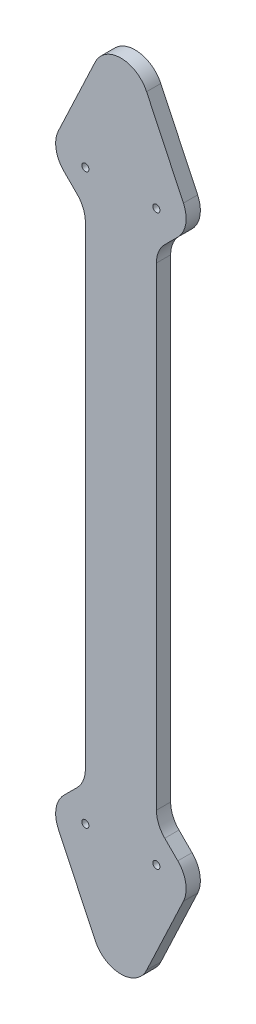
ISO-10303-21;
HEADER;
FILE_DESCRIPTION(('STEP AP214'),'2;1');
FILE_NAME('part.step','',(''),(''),'','','');
FILE_SCHEMA(('AUTOMOTIVE_DESIGN { 1 0 10303 214 1 1 1 1 }'));
ENDSEC;
DATA;
#1=APPLICATION_CONTEXT('core data for automotive mechanical design processes');
#2=APPLICATION_PROTOCOL_DEFINITION('international standard','automotive_design',2000,#1);
#3=PRODUCT_CONTEXT('',#1,'mechanical');
#4=PRODUCT('Part','Part','',(#3));
#5=PRODUCT_RELATED_PRODUCT_CATEGORY('part','',(#4));
#6=PRODUCT_DEFINITION_FORMATION('','',#4);
#7=PRODUCT_DEFINITION_CONTEXT('part definition',#1,'design');
#8=PRODUCT_DEFINITION('design','',#6,#7);
#9=PRODUCT_DEFINITION_SHAPE('','',#8);
#10=(LENGTH_UNIT() NAMED_UNIT(*) SI_UNIT(.MILLI.,.METRE.));
#11=(NAMED_UNIT(*) PLANE_ANGLE_UNIT() SI_UNIT($,.RADIAN.));
#12=(NAMED_UNIT(*) SI_UNIT($,.STERADIAN.) SOLID_ANGLE_UNIT());
#13=UNCERTAINTY_MEASURE_WITH_UNIT(LENGTH_MEASURE(1.E-05),#10,'distance_accuracy_value','');
#14=(GEOMETRIC_REPRESENTATION_CONTEXT(3) GLOBAL_UNCERTAINTY_ASSIGNED_CONTEXT((#13)) GLOBAL_UNIT_ASSIGNED_CONTEXT((#10,
#11,#12)) REPRESENTATION_CONTEXT('',''));
#15=CARTESIAN_POINT('',(0.,0.,0.));
#16=DIRECTION('',(0.,0.,1.));
#17=DIRECTION('',(1.,0.,0.));
#18=AXIS2_PLACEMENT_3D('',#15,#16,#17);
#19=CARTESIAN_POINT('',(9.00000000000001,33.3431457505076,2.));
#20=DIRECTION('',(0.,0.,-1.));
#21=DIRECTION('',(-1.,0.,0.));
#22=AXIS2_PLACEMENT_3D('',#19,#20,#21);
#23=PLANE('',#22);
#24=CARTESIAN_POINT('',(9.00000000000001,33.3431457505076,2.));
#25=DIRECTION('',(0.,0.,-1.));
#26=DIRECTION('',(-1.,0.,0.));
#27=AXIS2_PLACEMENT_3D('',#24,#25,#26);
#28=CIRCLE('',#27,4.00000000000001);
#29=CARTESIAN_POINT('',(4.99999999999999,33.3431457505076,2.));
#30=VERTEX_POINT('',#29);
#31=CARTESIAN_POINT('',(6.17157287525381,36.1715728752538,2.));
#32=VERTEX_POINT('',#31);
#33=EDGE_CURVE('E278',#30,#32,#28,.T.);
#34=ORIENTED_EDGE('',*,*,#33,.T.);
#35=DIRECTION('',(0.707106781186552,0.707106781186542,0.));
#36=VECTOR('',#35,1.);
#37=CARTESIAN_POINT('',(8.01025068313439,38.0102506831344,2.));
#38=LINE('',#37,#36);
#39=CARTESIAN_POINT('',(8.01025068313439,38.0102506831344,2.));
#40=VERTEX_POINT('',#39);
#41=EDGE_CURVE('E142',#32,#40,#38,.T.);
#42=ORIENTED_EDGE('',*,*,#41,.T.);
#43=CARTESIAN_POINT('',(5.1818235583882,40.8386778078806,2.));
#44=DIRECTION('',(0.,0.,1.));
#45=DIRECTION('',(1.,0.,0.));
#46=AXIS2_PLACEMENT_3D('',#43,#44,#45);
#47=CIRCLE('',#46,4.);
#48=CARTESIAN_POINT('',(8.79960124471442,42.5450437159789,2.));
#49=VERTEX_POINT('',#48);
#50=EDGE_CURVE('E347',#40,#49,#47,.T.);
#51=ORIENTED_EDGE('',*,*,#50,.T.);
#52=DIRECTION('',(-0.426591477024574,0.904444421581554,0.));
#53=VECTOR('',#52,1.);
#54=CARTESIAN_POINT('',(3.61777768632622,53.5313659080983,2.));
#55=LINE('',#54,#53);
#56=CARTESIAN_POINT('',(3.61777768632622,53.5313659080983,2.));
#57=VERTEX_POINT('',#56);
#58=EDGE_CURVE('E367',#49,#57,#55,.T.);
#59=ORIENTED_EDGE('',*,*,#58,.T.);
#60=CARTESIAN_POINT('',(0.,51.825,2.));
#61=DIRECTION('',(0.,0.,1.));
#62=DIRECTION('',(-1.,0.,0.));
#63=AXIS2_PLACEMENT_3D('',#60,#61,#62);
#64=CIRCLE('',#63,4.00000000000001);
#65=CARTESIAN_POINT('',(-3.61777768632622,53.5313659080983,2.));
#66=VERTEX_POINT('',#65);
#67=EDGE_CURVE('E363',#57,#66,#64,.T.);
#68=ORIENTED_EDGE('',*,*,#67,.T.);
#69=DIRECTION('',(-0.426591477024574,-0.904444421581554,0.));
#70=VECTOR('',#69,1.);
#71=CARTESIAN_POINT('',(-3.61777768632622,53.5313659080983,2.));
#72=LINE('',#71,#70);
#73=CARTESIAN_POINT('',(-8.79960124471442,42.5450437159789,2.));
#74=VERTEX_POINT('',#73);
#75=EDGE_CURVE('E366',#66,#74,#72,.T.);
#76=ORIENTED_EDGE('',*,*,#75,.T.);
#77=CARTESIAN_POINT('',(-5.1818235583882,40.8386778078806,2.));
#78=DIRECTION('',(0.,0.,1.));
#79=DIRECTION('',(1.,0.,0.));
#80=AXIS2_PLACEMENT_3D('',#77,#78,#79);
#81=CIRCLE('',#80,4.);
#82=CARTESIAN_POINT('',(-8.01025068313439,38.0102506831344,2.));
#83=VERTEX_POINT('',#82);
#84=EDGE_CURVE('E371',#74,#83,#81,.T.);
#85=ORIENTED_EDGE('',*,*,#84,.T.);
#86=DIRECTION('',(0.707106781186552,-0.707106781186542,0.));
#87=VECTOR('',#86,1.);
#88=CARTESIAN_POINT('',(-8.01025068313439,38.0102506831344,2.));
#89=LINE('',#88,#87);
#90=CARTESIAN_POINT('',(-6.17157287525381,36.1715728752538,2.));
#91=VERTEX_POINT('',#90);
#92=EDGE_CURVE('E378',#83,#91,#89,.T.);
#93=ORIENTED_EDGE('',*,*,#92,.T.);
#94=CARTESIAN_POINT('',(-9.00000000000001,33.3431457505076,2.));
#95=DIRECTION('',(0.,0.,-1.));
#96=DIRECTION('',(-1.,0.,0.));
#97=AXIS2_PLACEMENT_3D('',#94,#95,#96);
#98=CIRCLE('',#97,4.00000000000001);
#99=CARTESIAN_POINT('',(-4.99999999999999,33.3431457505076,2.));
#100=VERTEX_POINT('',#99);
#101=EDGE_CURVE('E381',#91,#100,#98,.T.);
#102=ORIENTED_EDGE('',*,*,#101,.T.);
#103=DIRECTION('',(0.,-1.,0.));
#104=VECTOR('',#103,1.);
#105=CARTESIAN_POINT('',(-4.99999999999999,33.3431457505076,2.));
#106=LINE('',#105,#104);
#107=CARTESIAN_POINT('',(-5.,-33.3431457505076,2.));
#108=VERTEX_POINT('',#107);
#109=EDGE_CURVE('E384',#100,#108,#106,.T.);
#110=ORIENTED_EDGE('',*,*,#109,.T.);
#111=CARTESIAN_POINT('',(-9.00000000000001,-33.3431457505076,2.));
#112=DIRECTION('',(0.,0.,-1.));
#113=DIRECTION('',(1.,0.,0.));
#114=AXIS2_PLACEMENT_3D('',#111,#112,#113);
#115=CIRCLE('',#114,4.00000000000001);
#116=CARTESIAN_POINT('',(-6.17157287525381,-36.1715728752538,2.));
#117=VERTEX_POINT('',#116);
#118=EDGE_CURVE('E387',#108,#117,#115,.T.);
#119=ORIENTED_EDGE('',*,*,#118,.T.);
#120=DIRECTION('',(-0.707106781186552,-0.707106781186542,0.));
#121=VECTOR('',#120,1.);
#122=CARTESIAN_POINT('',(-8.01025068313439,-38.0102506831344,2.));
#123=LINE('',#122,#121);
#124=CARTESIAN_POINT('',(-8.01025068313439,-38.0102506831344,2.));
#125=VERTEX_POINT('',#124);
#126=EDGE_CURVE('E390',#117,#125,#123,.T.);
#127=ORIENTED_EDGE('',*,*,#126,.T.);
#128=CARTESIAN_POINT('',(-5.1818235583882,-40.8386778078806,2.));
#129=DIRECTION('',(0.,0.,1.));
#130=DIRECTION('',(1.,0.,0.));
#131=AXIS2_PLACEMENT_3D('',#128,#129,#130);
#132=CIRCLE('',#131,4.);
#133=CARTESIAN_POINT('',(-8.79960124471442,-42.5450437159789,2.));
#134=VERTEX_POINT('',#133);
#135=EDGE_CURVE('E393',#125,#134,#132,.T.);
#136=ORIENTED_EDGE('',*,*,#135,.T.);
#137=DIRECTION('',(0.426591477024574,-0.904444421581554,0.));
#138=VECTOR('',#137,1.);
#139=CARTESIAN_POINT('',(-3.61777768632622,-53.5313659080983,2.));
#140=LINE('',#139,#138);
#141=CARTESIAN_POINT('',(-3.61777768632623,-53.5313659080983,2.));
#142=VERTEX_POINT('',#141);
#143=EDGE_CURVE('E396',#134,#142,#140,.T.);
#144=ORIENTED_EDGE('',*,*,#143,.T.);
#145=CARTESIAN_POINT('',(0.,-51.825,2.));
#146=DIRECTION('',(0.,0.,1.));
#147=DIRECTION('',(-1.,0.,0.));
#148=AXIS2_PLACEMENT_3D('',#145,#146,#147);
#149=CIRCLE('',#148,4.00000000000001);
#150=CARTESIAN_POINT('',(3.61777768632622,-53.5313659080983,2.));
#151=VERTEX_POINT('',#150);
#152=EDGE_CURVE('E399',#142,#151,#149,.T.);
#153=ORIENTED_EDGE('',*,*,#152,.T.);
#154=DIRECTION('',(0.426591477024574,0.904444421581554,0.));
#155=VECTOR('',#154,1.);
#156=CARTESIAN_POINT('',(3.61777768632622,-53.5313659080983,2.));
#157=LINE('',#156,#155);
#158=CARTESIAN_POINT('',(8.79960124471442,-42.5450437159789,2.));
#159=VERTEX_POINT('',#158);
#160=EDGE_CURVE('E402',#151,#159,#157,.T.);
#161=ORIENTED_EDGE('',*,*,#160,.T.);
#162=CARTESIAN_POINT('',(5.1818235583882,-40.8386778078806,2.));
#163=DIRECTION('',(0.,0.,1.));
#164=DIRECTION('',(-1.,0.,0.));
#165=AXIS2_PLACEMENT_3D('',#162,#163,#164);
#166=CIRCLE('',#165,4.);
#167=CARTESIAN_POINT('',(8.01025068313439,-38.0102506831344,2.));
#168=VERTEX_POINT('',#167);
#169=EDGE_CURVE('E197',#159,#168,#166,.T.);
#170=ORIENTED_EDGE('',*,*,#169,.T.);
#171=DIRECTION('',(-0.707106781186552,0.707106781186542,0.));
#172=VECTOR('',#171,1.);
#173=CARTESIAN_POINT('',(8.01025068313439,-38.0102506831344,2.));
#174=LINE('',#173,#172);
#175=CARTESIAN_POINT('',(6.17157287525381,-36.1715728752538,2.));
#176=VERTEX_POINT('',#175);
#177=EDGE_CURVE('E191',#168,#176,#174,.T.);
#178=ORIENTED_EDGE('',*,*,#177,.T.);
#179=CARTESIAN_POINT('',(9.00000000000001,-33.3431457505076,2.));
#180=DIRECTION('',(0.,0.,-1.));
#181=DIRECTION('',(-1.,0.,0.));
#182=AXIS2_PLACEMENT_3D('',#179,#180,#181);
#183=CIRCLE('',#182,4.00000000000001);
#184=CARTESIAN_POINT('',(4.99999999999999,-33.3431457505076,2.));
#185=VERTEX_POINT('',#184);
#186=EDGE_CURVE('E195',#176,#185,#183,.T.);
#187=ORIENTED_EDGE('',*,*,#186,.T.);
#188=DIRECTION('',(0.,1.,0.));
#189=VECTOR('',#188,1.);
#190=CARTESIAN_POINT('',(4.99999999999999,33.3431457505076,2.));
#191=LINE('',#190,#189);
#192=EDGE_CURVE('E63',#185,#30,#191,.T.);
#193=ORIENTED_EDGE('',*,*,#192,.T.);
#194=EDGE_LOOP('',(#34,#42,#51,#59,#68,#76,#85,#93,#102,#110,#119,#127,#136,#144,#153,#161,#170,
#178,#187,#193));
#195=FACE_BOUND('',#194,.T.);
#196=CARTESIAN_POINT('',(5.,40.,2.));
#197=DIRECTION('',(0.,0.,1.));
#198=DIRECTION('',(-1.,0.,0.));
#199=AXIS2_PLACEMENT_3D('',#196,#197,#198);
#200=CIRCLE('',#199,0.5);
#201=CARTESIAN_POINT('',(4.5,40.,2.));
#202=VERTEX_POINT('',#201);
#203=EDGE_CURVE('E224',#202,#202,#200,.T.);
#204=ORIENTED_EDGE('',*,*,#203,.F.);
#205=EDGE_LOOP('',(#204));
#206=FACE_BOUND('',#205,.T.);
#207=CARTESIAN_POINT('',(-5.,40.,2.));
#208=DIRECTION('',(0.,0.,1.));
#209=DIRECTION('',(1.,0.,0.));
#210=AXIS2_PLACEMENT_3D('',#207,#208,#209);
#211=CIRCLE('',#210,0.5);
#212=CARTESIAN_POINT('',(-4.5,40.,2.));
#213=VERTEX_POINT('',#212);
#214=EDGE_CURVE('E472',#213,#213,#211,.T.);
#215=ORIENTED_EDGE('',*,*,#214,.F.);
#216=EDGE_LOOP('',(#215));
#217=FACE_BOUND('',#216,.T.);
#218=CARTESIAN_POINT('',(5.,-40.,2.));
#219=DIRECTION('',(0.,0.,1.));
#220=DIRECTION('',(1.,0.,0.));
#221=AXIS2_PLACEMENT_3D('',#218,#219,#220);
#222=CIRCLE('',#221,0.5);
#223=CARTESIAN_POINT('',(5.5,-40.,2.));
#224=VERTEX_POINT('',#223);
#225=EDGE_CURVE('E464',#224,#224,#222,.T.);
#226=ORIENTED_EDGE('',*,*,#225,.F.);
#227=EDGE_LOOP('',(#226));
#228=FACE_BOUND('',#227,.T.);
#229=CARTESIAN_POINT('',(-5.,-40.,2.));
#230=DIRECTION('',(0.,0.,1.));
#231=DIRECTION('',(-1.,0.,0.));
#232=AXIS2_PLACEMENT_3D('',#229,#230,#231);
#233=CIRCLE('',#232,0.5);
#234=CARTESIAN_POINT('',(-5.5,-40.,2.));
#235=VERTEX_POINT('',#234);
#236=EDGE_CURVE('E453',#235,#235,#233,.T.);
#237=ORIENTED_EDGE('',*,*,#236,.F.);
#238=EDGE_LOOP('',(#237));
#239=FACE_BOUND('',#238,.T.);
#240=ADVANCED_FACE('F45',(#195,#206,#217,#228,#239),#23,.F.);
#241=CARTESIAN_POINT('',(9.00000000000001,33.3431457505076,0.));
#242=DIRECTION('',(0.,0.,-1.));
#243=DIRECTION('',(-1.,0.,0.));
#244=AXIS2_PLACEMENT_3D('',#241,#242,#243);
#245=PLANE('',#244);
#246=CARTESIAN_POINT('',(5.,-40.,0.));
#247=DIRECTION('',(0.,0.,1.));
#248=DIRECTION('',(1.,0.,0.));
#249=AXIS2_PLACEMENT_3D('',#246,#247,#248);
#250=CIRCLE('',#249,0.5);
#251=CARTESIAN_POINT('',(5.5,-40.,0.));
#252=VERTEX_POINT('',#251);
#253=EDGE_CURVE('E461',#252,#252,#250,.T.);
#254=ORIENTED_EDGE('',*,*,#253,.T.);
#255=EDGE_LOOP('',(#254));
#256=FACE_BOUND('',#255,.T.);
#257=CARTESIAN_POINT('',(5.,40.,0.));
#258=DIRECTION('',(0.,0.,1.));
#259=DIRECTION('',(-1.,0.,0.));
#260=AXIS2_PLACEMENT_3D('',#257,#258,#259);
#261=CIRCLE('',#260,0.5);
#262=CARTESIAN_POINT('',(4.5,40.,0.));
#263=VERTEX_POINT('',#262);
#264=EDGE_CURVE('E476',#263,#263,#261,.T.);
#265=ORIENTED_EDGE('',*,*,#264,.T.);
#266=EDGE_LOOP('',(#265));
#267=FACE_BOUND('',#266,.T.);
#268=CARTESIAN_POINT('',(9.00000000000001,33.3431457505076,0.));
#269=DIRECTION('',(0.,0.,-1.));
#270=DIRECTION('',(-1.,0.,0.));
#271=AXIS2_PLACEMENT_3D('',#268,#269,#270);
#272=CIRCLE('',#271,4.00000000000001);
#273=CARTESIAN_POINT('',(4.99999999999999,33.3431457505076,0.));
#274=VERTEX_POINT('',#273);
#275=CARTESIAN_POINT('',(6.17157287525381,36.1715728752538,0.));
#276=VERTEX_POINT('',#275);
#277=EDGE_CURVE('E219',#274,#276,#272,.T.);
#278=ORIENTED_EDGE('',*,*,#277,.F.);
#279=DIRECTION('',(0.,1.,0.));
#280=VECTOR('',#279,1.);
#281=CARTESIAN_POINT('',(4.99999999999999,33.3431457505076,0.));
#282=LINE('',#281,#280);
#283=CARTESIAN_POINT('',(4.99999999999999,-33.3431457505076,0.));
#284=VERTEX_POINT('',#283);
#285=EDGE_CURVE('E134',#284,#274,#282,.T.);
#286=ORIENTED_EDGE('',*,*,#285,.F.);
#287=CARTESIAN_POINT('',(9.00000000000001,-33.3431457505076,0.));
#288=DIRECTION('',(0.,0.,-1.));
#289=DIRECTION('',(-1.,0.,0.));
#290=AXIS2_PLACEMENT_3D('',#287,#288,#289);
#291=CIRCLE('',#290,4.00000000000001);
#292=CARTESIAN_POINT('',(6.17157287525381,-36.1715728752538,0.));
#293=VERTEX_POINT('',#292);
#294=EDGE_CURVE('E128',#293,#284,#291,.T.);
#295=ORIENTED_EDGE('',*,*,#294,.F.);
#296=DIRECTION('',(-0.707106781186552,0.707106781186542,0.));
#297=VECTOR('',#296,1.);
#298=CARTESIAN_POINT('',(8.01025068313439,-38.0102506831344,0.));
#299=LINE('',#298,#297);
#300=CARTESIAN_POINT('',(8.01025068313439,-38.0102506831344,0.));
#301=VERTEX_POINT('',#300);
#302=EDGE_CURVE('E206',#301,#293,#299,.T.);
#303=ORIENTED_EDGE('',*,*,#302,.F.);
#304=CARTESIAN_POINT('',(5.1818235583882,-40.8386778078806,0.));
#305=DIRECTION('',(0.,0.,1.));
#306=DIRECTION('',(-1.,0.,0.));
#307=AXIS2_PLACEMENT_3D('',#304,#305,#306);
#308=CIRCLE('',#307,4.);
#309=CARTESIAN_POINT('',(8.79960124471442,-42.5450437159789,0.));
#310=VERTEX_POINT('',#309);
#311=EDGE_CURVE('E269',#310,#301,#308,.T.);
#312=ORIENTED_EDGE('',*,*,#311,.F.);
#313=DIRECTION('',(0.426591477024574,0.904444421581554,0.));
#314=VECTOR('',#313,1.);
#315=CARTESIAN_POINT('',(3.61777768632622,-53.5313659080983,0.));
#316=LINE('',#315,#314);
#317=CARTESIAN_POINT('',(3.61777768632622,-53.5313659080983,0.));
#318=VERTEX_POINT('',#317);
#319=EDGE_CURVE('E266',#318,#310,#316,.T.);
#320=ORIENTED_EDGE('',*,*,#319,.F.);
#321=CARTESIAN_POINT('',(0.,-51.825,0.));
#322=DIRECTION('',(0.,0.,1.));
#323=DIRECTION('',(-1.,0.,0.));
#324=AXIS2_PLACEMENT_3D('',#321,#322,#323);
#325=CIRCLE('',#324,4.00000000000001);
#326=CARTESIAN_POINT('',(-3.61777768632623,-53.5313659080983,0.));
#327=VERTEX_POINT('',#326);
#328=EDGE_CURVE('E263',#327,#318,#325,.T.);
#329=ORIENTED_EDGE('',*,*,#328,.F.);
#330=DIRECTION('',(0.426591477024574,-0.904444421581554,0.));
#331=VECTOR('',#330,1.);
#332=CARTESIAN_POINT('',(-3.61777768632622,-53.5313659080983,0.));
#333=LINE('',#332,#331);
#334=CARTESIAN_POINT('',(-8.79960124471442,-42.5450437159789,0.));
#335=VERTEX_POINT('',#334);
#336=EDGE_CURVE('E260',#335,#327,#333,.T.);
#337=ORIENTED_EDGE('',*,*,#336,.F.);
#338=CARTESIAN_POINT('',(-5.1818235583882,-40.8386778078806,0.));
#339=DIRECTION('',(0.,0.,1.));
#340=DIRECTION('',(1.,0.,0.));
#341=AXIS2_PLACEMENT_3D('',#338,#339,#340);
#342=CIRCLE('',#341,4.);
#343=CARTESIAN_POINT('',(-8.01025068313439,-38.0102506831344,0.));
#344=VERTEX_POINT('',#343);
#345=EDGE_CURVE('E257',#344,#335,#342,.T.);
#346=ORIENTED_EDGE('',*,*,#345,.F.);
#347=DIRECTION('',(-0.707106781186552,-0.707106781186542,0.));
#348=VECTOR('',#347,1.);
#349=CARTESIAN_POINT('',(-8.01025068313439,-38.0102506831344,0.));
#350=LINE('',#349,#348);
#351=CARTESIAN_POINT('',(-6.17157287525381,-36.1715728752538,0.));
#352=VERTEX_POINT('',#351);
#353=EDGE_CURVE('E254',#352,#344,#350,.T.);
#354=ORIENTED_EDGE('',*,*,#353,.F.);
#355=CARTESIAN_POINT('',(-9.00000000000001,-33.3431457505076,0.));
#356=DIRECTION('',(0.,0.,-1.));
#357=DIRECTION('',(1.,0.,0.));
#358=AXIS2_PLACEMENT_3D('',#355,#356,#357);
#359=CIRCLE('',#358,4.00000000000001);
#360=CARTESIAN_POINT('',(-5.,-33.3431457505076,0.));
#361=VERTEX_POINT('',#360);
#362=EDGE_CURVE('E251',#361,#352,#359,.T.);
#363=ORIENTED_EDGE('',*,*,#362,.F.);
#364=DIRECTION('',(0.,-1.,0.));
#365=VECTOR('',#364,1.);
#366=CARTESIAN_POINT('',(-4.99999999999999,33.3431457505076,0.));
#367=LINE('',#366,#365);
#368=CARTESIAN_POINT('',(-4.99999999999999,33.3431457505076,0.));
#369=VERTEX_POINT('',#368);
#370=EDGE_CURVE('E248',#369,#361,#367,.T.);
#371=ORIENTED_EDGE('',*,*,#370,.F.);
#372=CARTESIAN_POINT('',(-9.00000000000001,33.3431457505076,0.));
#373=DIRECTION('',(0.,0.,-1.));
#374=DIRECTION('',(-1.,0.,0.));
#375=AXIS2_PLACEMENT_3D('',#372,#373,#374);
#376=CIRCLE('',#375,4.00000000000001);
#377=CARTESIAN_POINT('',(-6.17157287525381,36.1715728752538,0.));
#378=VERTEX_POINT('',#377);
#379=EDGE_CURVE('E245',#378,#369,#376,.T.);
#380=ORIENTED_EDGE('',*,*,#379,.F.);
#381=DIRECTION('',(0.707106781186552,-0.707106781186542,0.));
#382=VECTOR('',#381,1.);
#383=CARTESIAN_POINT('',(-8.01025068313439,38.0102506831344,0.));
#384=LINE('',#383,#382);
#385=CARTESIAN_POINT('',(-8.01025068313439,38.0102506831344,0.));
#386=VERTEX_POINT('',#385);
#387=EDGE_CURVE('E242',#386,#378,#384,.T.);
#388=ORIENTED_EDGE('',*,*,#387,.F.);
#389=CARTESIAN_POINT('',(-5.1818235583882,40.8386778078806,0.));
#390=DIRECTION('',(0.,0.,1.));
#391=DIRECTION('',(1.,0.,0.));
#392=AXIS2_PLACEMENT_3D('',#389,#390,#391);
#393=CIRCLE('',#392,4.);
#394=CARTESIAN_POINT('',(-8.79960124471442,42.5450437159789,0.));
#395=VERTEX_POINT('',#394);
#396=EDGE_CURVE('E239',#395,#386,#393,.T.);
#397=ORIENTED_EDGE('',*,*,#396,.F.);
#398=DIRECTION('',(-0.426591477024574,-0.904444421581554,0.));
#399=VECTOR('',#398,1.);
#400=CARTESIAN_POINT('',(-3.61777768632622,53.5313659080983,0.));
#401=LINE('',#400,#399);
#402=CARTESIAN_POINT('',(-3.61777768632622,53.5313659080983,0.));
#403=VERTEX_POINT('',#402);
#404=EDGE_CURVE('E236',#403,#395,#401,.T.);
#405=ORIENTED_EDGE('',*,*,#404,.F.);
#406=CARTESIAN_POINT('',(0.,51.825,0.));
#407=DIRECTION('',(0.,0.,1.));
#408=DIRECTION('',(-1.,0.,0.));
#409=AXIS2_PLACEMENT_3D('',#406,#407,#408);
#410=CIRCLE('',#409,4.00000000000001);
#411=CARTESIAN_POINT('',(3.61777768632622,53.5313659080983,0.));
#412=VERTEX_POINT('',#411);
#413=EDGE_CURVE('E233',#412,#403,#410,.T.);
#414=ORIENTED_EDGE('',*,*,#413,.F.);
#415=DIRECTION('',(-0.426591477024574,0.904444421581554,0.));
#416=VECTOR('',#415,1.);
#417=CARTESIAN_POINT('',(3.61777768632622,53.5313659080983,0.));
#418=LINE('',#417,#416);
#419=CARTESIAN_POINT('',(8.79960124471442,42.5450437159789,0.));
#420=VERTEX_POINT('',#419);
#421=EDGE_CURVE('E230',#420,#412,#418,.T.);
#422=ORIENTED_EDGE('',*,*,#421,.F.);
#423=CARTESIAN_POINT('',(5.1818235583882,40.8386778078806,0.));
#424=DIRECTION('',(0.,0.,1.));
#425=DIRECTION('',(1.,0.,0.));
#426=AXIS2_PLACEMENT_3D('',#423,#424,#425);
#427=CIRCLE('',#426,4.);
#428=CARTESIAN_POINT('',(8.01025068313439,38.0102506831344,0.));
#429=VERTEX_POINT('',#428);
#430=EDGE_CURVE('E227',#429,#420,#427,.T.);
#431=ORIENTED_EDGE('',*,*,#430,.F.);
#432=DIRECTION('',(0.707106781186552,0.707106781186542,0.));
#433=VECTOR('',#432,1.);
#434=CARTESIAN_POINT('',(8.01025068313439,38.0102506831344,0.));
#435=LINE('',#434,#433);
#436=EDGE_CURVE('E223',#276,#429,#435,.T.);
#437=ORIENTED_EDGE('',*,*,#436,.F.);
#438=EDGE_LOOP('',(#278,#286,#295,#303,#312,#320,#329,#337,#346,#354,#363,#371,#380,#388,#397,
#405,#414,#422,#431,#437));
#439=FACE_BOUND('',#438,.T.);
#440=CARTESIAN_POINT('',(-5.,40.,0.));
#441=DIRECTION('',(0.,0.,1.));
#442=DIRECTION('',(1.,0.,0.));
#443=AXIS2_PLACEMENT_3D('',#440,#441,#442);
#444=CIRCLE('',#443,0.5);
#445=CARTESIAN_POINT('',(-4.5,40.,0.));
#446=VERTEX_POINT('',#445);
#447=EDGE_CURVE('E468',#446,#446,#444,.T.);
#448=ORIENTED_EDGE('',*,*,#447,.T.);
#449=EDGE_LOOP('',(#448));
#450=FACE_BOUND('',#449,.T.);
#451=CARTESIAN_POINT('',(-5.,-40.,0.));
#452=DIRECTION('',(0.,0.,1.));
#453=DIRECTION('',(-1.,0.,0.));
#454=AXIS2_PLACEMENT_3D('',#451,#452,#453);
#455=CIRCLE('',#454,0.5);
#456=CARTESIAN_POINT('',(-5.5,-40.,0.));
#457=VERTEX_POINT('',#456);
#458=EDGE_CURVE('E456',#457,#457,#455,.T.);
#459=ORIENTED_EDGE('',*,*,#458,.T.);
#460=EDGE_LOOP('',(#459));
#461=FACE_BOUND('',#460,.T.);
#462=ADVANCED_FACE('F351',(#256,#267,#439,#450,#461),#245,.T.);
#463=CARTESIAN_POINT('',(9.00000000000001,33.3431457505076,2.));
#464=DIRECTION('',(0.,0.,-1.));
#465=DIRECTION('',(-1.,0.,0.));
#466=AXIS2_PLACEMENT_3D('',#463,#464,#465);
#467=CYLINDRICAL_SURFACE('',#466,4.00000000000001);
#468=ORIENTED_EDGE('',*,*,#277,.T.);
#469=DIRECTION('',(0.,0.,-1.));
#470=VECTOR('',#469,1.);
#471=CARTESIAN_POINT('',(6.17157287525381,36.1715728752538,2.));
#472=LINE('',#471,#470);
#473=EDGE_CURVE('E11',#32,#276,#472,.T.);
#474=ORIENTED_EDGE('',*,*,#473,.F.);
#475=ORIENTED_EDGE('',*,*,#33,.F.);
#476=DIRECTION('',(0.,0.,-1.));
#477=VECTOR('',#476,1.);
#478=CARTESIAN_POINT('',(4.99999999999999,33.3431457505076,2.));
#479=LINE('',#478,#477);
#480=EDGE_CURVE('E215',#30,#274,#479,.T.);
#481=ORIENTED_EDGE('',*,*,#480,.T.);
#482=EDGE_LOOP('',(#468,#474,#475,#481));
#483=FACE_BOUND('',#482,.T.);
#484=ADVANCED_FACE('F47',(#483),#467,.F.);
#485=CARTESIAN_POINT('',(8.01025068313439,38.0102506831344,2.));
#486=DIRECTION('',(-0.707106781186543,0.707106781186553,0.));
#487=DIRECTION('',(-0.707106781186553,-0.707106781186542,0.));
#488=AXIS2_PLACEMENT_3D('',#485,#486,#487);
#489=PLANE('',#488);
#490=ORIENTED_EDGE('',*,*,#436,.T.);
#491=DIRECTION('',(0.,0.,-1.));
#492=VECTOR('',#491,1.);
#493=CARTESIAN_POINT('',(8.01025068313439,38.0102506831344,2.));
#494=LINE('',#493,#492);
#495=EDGE_CURVE('E55',#40,#429,#494,.T.);
#496=ORIENTED_EDGE('',*,*,#495,.F.);
#497=ORIENTED_EDGE('',*,*,#41,.F.);
#498=ORIENTED_EDGE('',*,*,#473,.T.);
#499=EDGE_LOOP('',(#490,#496,#497,#498));
#500=FACE_BOUND('',#499,.T.);
#501=ADVANCED_FACE('F678',(#500),#489,.F.);
#502=CARTESIAN_POINT('',(5.1818235583882,40.8386778078806,2.));
#503=DIRECTION('',(0.,0.,-1.));
#504=DIRECTION('',(-1.,0.,0.));
#505=AXIS2_PLACEMENT_3D('',#502,#503,#504);
#506=CYLINDRICAL_SURFACE('',#505,4.);
#507=ORIENTED_EDGE('',*,*,#430,.T.);
#508=DIRECTION('',(0.,0.,-1.));
#509=VECTOR('',#508,1.);
#510=CARTESIAN_POINT('',(8.79960124471442,42.5450437159789,2.));
#511=LINE('',#510,#509);
#512=EDGE_CURVE('E337',#49,#420,#511,.T.);
#513=ORIENTED_EDGE('',*,*,#512,.F.);
#514=ORIENTED_EDGE('',*,*,#50,.F.);
#515=ORIENTED_EDGE('',*,*,#495,.T.);
#516=EDGE_LOOP('',(#507,#513,#514,#515));
#517=FACE_BOUND('',#516,.T.);
#518=ADVANCED_FACE('F345',(#517),#506,.T.);
#519=CARTESIAN_POINT('',(3.61777768632622,53.5313659080983,2.));
#520=DIRECTION('',(-0.904444421581554,-0.426591477024574,0.));
#521=DIRECTION('',(0.426591477024574,-0.904444421581554,0.));
#522=AXIS2_PLACEMENT_3D('',#519,#520,#521);
#523=PLANE('',#522);
#524=ORIENTED_EDGE('',*,*,#421,.T.);
#525=DIRECTION('',(0.,0.,-1.));
#526=VECTOR('',#525,1.);
#527=CARTESIAN_POINT('',(3.61777768632622,53.5313659080983,2.));
#528=LINE('',#527,#526);
#529=EDGE_CURVE('E333',#57,#412,#528,.T.);
#530=ORIENTED_EDGE('',*,*,#529,.F.);
#531=ORIENTED_EDGE('',*,*,#58,.F.);
#532=ORIENTED_EDGE('',*,*,#512,.T.);
#533=EDGE_LOOP('',(#524,#530,#531,#532));
#534=FACE_BOUND('',#533,.T.);
#535=ADVANCED_FACE('F357',(#534),#523,.F.);
#536=CARTESIAN_POINT('',(0.,51.825,2.));
#537=DIRECTION('',(0.,0.,-1.));
#538=DIRECTION('',(-1.,0.,0.));
#539=AXIS2_PLACEMENT_3D('',#536,#537,#538);
#540=CYLINDRICAL_SURFACE('',#539,4.00000000000001);
#541=ORIENTED_EDGE('',*,*,#413,.T.);
#542=DIRECTION('',(0.,0.,-1.));
#543=VECTOR('',#542,1.);
#544=CARTESIAN_POINT('',(-3.61777768632622,53.5313659080983,2.));
#545=LINE('',#544,#543);
#546=EDGE_CURVE('E329',#66,#403,#545,.T.);
#547=ORIENTED_EDGE('',*,*,#546,.F.);
#548=ORIENTED_EDGE('',*,*,#67,.F.);
#549=ORIENTED_EDGE('',*,*,#529,.T.);
#550=EDGE_LOOP('',(#541,#547,#548,#549));
#551=FACE_BOUND('',#550,.T.);
#552=ADVANCED_FACE('F361',(#551),#540,.T.);
#553=CARTESIAN_POINT('',(-3.61777768632622,53.5313659080983,2.));
#554=DIRECTION('',(0.904444421581554,-0.426591477024574,0.));
#555=DIRECTION('',(0.426591477024574,0.904444421581554,0.));
#556=AXIS2_PLACEMENT_3D('',#553,#554,#555);
#557=PLANE('',#556);
#558=ORIENTED_EDGE('',*,*,#404,.T.);
#559=DIRECTION('',(0.,0.,-1.));
#560=VECTOR('',#559,1.);
#561=CARTESIAN_POINT('',(-8.79960124471442,42.5450437159789,2.));
#562=LINE('',#561,#560);
#563=EDGE_CURVE('E325',#74,#395,#562,.T.);
#564=ORIENTED_EDGE('',*,*,#563,.F.);
#565=ORIENTED_EDGE('',*,*,#75,.F.);
#566=ORIENTED_EDGE('',*,*,#546,.T.);
#567=EDGE_LOOP('',(#558,#564,#565,#566));
#568=FACE_BOUND('',#567,.T.);
#569=ADVANCED_FACE('F643',(#568),#557,.F.);
#570=CARTESIAN_POINT('',(-5.1818235583882,40.8386778078806,2.));
#571=DIRECTION('',(0.,0.,-1.));
#572=DIRECTION('',(-1.,0.,0.));
#573=AXIS2_PLACEMENT_3D('',#570,#571,#572);
#574=CYLINDRICAL_SURFACE('',#573,4.);
#575=ORIENTED_EDGE('',*,*,#396,.T.);
#576=DIRECTION('',(0.,0.,-1.));
#577=VECTOR('',#576,1.);
#578=CARTESIAN_POINT('',(-8.01025068313439,38.0102506831344,2.));
#579=LINE('',#578,#577);
#580=EDGE_CURVE('E321',#83,#386,#579,.T.);
#581=ORIENTED_EDGE('',*,*,#580,.F.);
#582=ORIENTED_EDGE('',*,*,#84,.F.);
#583=ORIENTED_EDGE('',*,*,#563,.T.);
#584=EDGE_LOOP('',(#575,#581,#582,#583));
#585=FACE_BOUND('',#584,.T.);
#586=ADVANCED_FACE('F633',(#585),#574,.T.);
#587=CARTESIAN_POINT('',(-8.01025068313439,38.0102506831344,2.));
#588=DIRECTION('',(0.707106781186543,0.707106781186553,0.));
#589=DIRECTION('',(-0.707106781186553,0.707106781186542,0.));
#590=AXIS2_PLACEMENT_3D('',#587,#588,#589);
#591=PLANE('',#590);
#592=ORIENTED_EDGE('',*,*,#387,.T.);
#593=DIRECTION('',(0.,0.,-1.));
#594=VECTOR('',#593,1.);
#595=CARTESIAN_POINT('',(-6.17157287525381,36.1715728752538,2.));
#596=LINE('',#595,#594);
#597=EDGE_CURVE('E317',#91,#378,#596,.T.);
#598=ORIENTED_EDGE('',*,*,#597,.F.);
#599=ORIENTED_EDGE('',*,*,#92,.F.);
#600=ORIENTED_EDGE('',*,*,#580,.T.);
#601=EDGE_LOOP('',(#592,#598,#599,#600));
#602=FACE_BOUND('',#601,.T.);
#603=ADVANCED_FACE('F623',(#602),#591,.F.);
#604=CARTESIAN_POINT('',(-9.00000000000001,33.3431457505076,2.));
#605=DIRECTION('',(0.,0.,-1.));
#606=DIRECTION('',(-1.,0.,0.));
#607=AXIS2_PLACEMENT_3D('',#604,#605,#606);
#608=CYLINDRICAL_SURFACE('',#607,4.00000000000001);
#609=ORIENTED_EDGE('',*,*,#379,.T.);
#610=DIRECTION('',(0.,0.,-1.));
#611=VECTOR('',#610,1.);
#612=CARTESIAN_POINT('',(-4.99999999999999,33.3431457505076,2.));
#613=LINE('',#612,#611);
#614=EDGE_CURVE('E313',#100,#369,#613,.T.);
#615=ORIENTED_EDGE('',*,*,#614,.F.);
#616=ORIENTED_EDGE('',*,*,#101,.F.);
#617=ORIENTED_EDGE('',*,*,#597,.T.);
#618=EDGE_LOOP('',(#609,#615,#616,#617));
#619=FACE_BOUND('',#618,.T.);
#620=ADVANCED_FACE('F613',(#619),#608,.F.);
#621=CARTESIAN_POINT('',(-4.99999999999999,33.3431457505076,2.));
#622=DIRECTION('',(1.,0.,0.));
#623=DIRECTION('',(0.,0.,-1.));
#624=AXIS2_PLACEMENT_3D('',#621,#622,#623);
#625=PLANE('',#624);
#626=ORIENTED_EDGE('',*,*,#370,.T.);
#627=DIRECTION('',(0.,0.,-1.));
#628=VECTOR('',#627,1.);
#629=CARTESIAN_POINT('',(-5.,-33.3431457505076,2.));
#630=LINE('',#629,#628);
#631=EDGE_CURVE('E309',#108,#361,#630,.T.);
#632=ORIENTED_EDGE('',*,*,#631,.F.);
#633=ORIENTED_EDGE('',*,*,#109,.F.);
#634=ORIENTED_EDGE('',*,*,#614,.T.);
#635=EDGE_LOOP('',(#626,#632,#633,#634));
#636=FACE_BOUND('',#635,.T.);
#637=ADVANCED_FACE('F603',(#636),#625,.F.);
#638=CARTESIAN_POINT('',(-9.00000000000001,-33.3431457505076,2.));
#639=DIRECTION('',(0.,0.,-1.));
#640=DIRECTION('',(-1.,0.,0.));
#641=AXIS2_PLACEMENT_3D('',#638,#639,#640);
#642=CYLINDRICAL_SURFACE('',#641,4.00000000000001);
#643=ORIENTED_EDGE('',*,*,#362,.T.);
#644=DIRECTION('',(0.,0.,-1.));
#645=VECTOR('',#644,1.);
#646=CARTESIAN_POINT('',(-6.17157287525381,-36.1715728752538,2.));
#647=LINE('',#646,#645);
#648=EDGE_CURVE('E305',#117,#352,#647,.T.);
#649=ORIENTED_EDGE('',*,*,#648,.F.);
#650=ORIENTED_EDGE('',*,*,#118,.F.);
#651=ORIENTED_EDGE('',*,*,#631,.T.);
#652=EDGE_LOOP('',(#643,#649,#650,#651));
#653=FACE_BOUND('',#652,.T.);
#654=ADVANCED_FACE('F593',(#653),#642,.F.);
#655=CARTESIAN_POINT('',(-8.01025068313439,-38.0102506831344,2.));
#656=DIRECTION('',(0.707106781186543,-0.707106781186553,0.));
#657=DIRECTION('',(0.707106781186553,0.707106781186542,0.));
#658=AXIS2_PLACEMENT_3D('',#655,#656,#657);
#659=PLANE('',#658);
#660=ORIENTED_EDGE('',*,*,#353,.T.);
#661=DIRECTION('',(0.,0.,-1.));
#662=VECTOR('',#661,1.);
#663=CARTESIAN_POINT('',(-8.01025068313439,-38.0102506831344,2.));
#664=LINE('',#663,#662);
#665=EDGE_CURVE('E301',#125,#344,#664,.T.);
#666=ORIENTED_EDGE('',*,*,#665,.F.);
#667=ORIENTED_EDGE('',*,*,#126,.F.);
#668=ORIENTED_EDGE('',*,*,#648,.T.);
#669=EDGE_LOOP('',(#660,#666,#667,#668));
#670=FACE_BOUND('',#669,.T.);
#671=ADVANCED_FACE('F583',(#670),#659,.F.);
#672=CARTESIAN_POINT('',(-5.1818235583882,-40.8386778078806,2.));
#673=DIRECTION('',(0.,0.,-1.));
#674=DIRECTION('',(-1.,0.,0.));
#675=AXIS2_PLACEMENT_3D('',#672,#673,#674);
#676=CYLINDRICAL_SURFACE('',#675,4.);
#677=ORIENTED_EDGE('',*,*,#345,.T.);
#678=DIRECTION('',(0.,0.,-1.));
#679=VECTOR('',#678,1.);
#680=CARTESIAN_POINT('',(-8.79960124471442,-42.5450437159789,2.));
#681=LINE('',#680,#679);
#682=EDGE_CURVE('E297',#134,#335,#681,.T.);
#683=ORIENTED_EDGE('',*,*,#682,.F.);
#684=ORIENTED_EDGE('',*,*,#135,.F.);
#685=ORIENTED_EDGE('',*,*,#665,.T.);
#686=EDGE_LOOP('',(#677,#683,#684,#685));
#687=FACE_BOUND('',#686,.T.);
#688=ADVANCED_FACE('F573',(#687),#676,.T.);
#689=CARTESIAN_POINT('',(-3.61777768632622,-53.5313659080983,2.));
#690=DIRECTION('',(0.904444421581554,0.426591477024574,0.));
#691=DIRECTION('',(-0.426591477024574,0.904444421581554,0.));
#692=AXIS2_PLACEMENT_3D('',#689,#690,#691);
#693=PLANE('',#692);
#694=ORIENTED_EDGE('',*,*,#336,.T.);
#695=DIRECTION('',(0.,0.,-1.));
#696=VECTOR('',#695,1.);
#697=CARTESIAN_POINT('',(-3.61777768632623,-53.5313659080983,2.));
#698=LINE('',#697,#696);
#699=EDGE_CURVE('E293',#142,#327,#698,.T.);
#700=ORIENTED_EDGE('',*,*,#699,.F.);
#701=ORIENTED_EDGE('',*,*,#143,.F.);
#702=ORIENTED_EDGE('',*,*,#682,.T.);
#703=EDGE_LOOP('',(#694,#700,#701,#702));
#704=FACE_BOUND('',#703,.T.);
#705=ADVANCED_FACE('F563',(#704),#693,.F.);
#706=CARTESIAN_POINT('',(0.,-51.825,2.));
#707=DIRECTION('',(0.,0.,-1.));
#708=DIRECTION('',(-1.,0.,0.));
#709=AXIS2_PLACEMENT_3D('',#706,#707,#708);
#710=CYLINDRICAL_SURFACE('',#709,4.00000000000001);
#711=ORIENTED_EDGE('',*,*,#328,.T.);
#712=DIRECTION('',(0.,0.,-1.));
#713=VECTOR('',#712,1.);
#714=CARTESIAN_POINT('',(3.61777768632622,-53.5313659080983,2.));
#715=LINE('',#714,#713);
#716=EDGE_CURVE('E289',#151,#318,#715,.T.);
#717=ORIENTED_EDGE('',*,*,#716,.F.);
#718=ORIENTED_EDGE('',*,*,#152,.F.);
#719=ORIENTED_EDGE('',*,*,#699,.T.);
#720=EDGE_LOOP('',(#711,#717,#718,#719));
#721=FACE_BOUND('',#720,.T.);
#722=ADVANCED_FACE('F554',(#721),#710,.T.);
#723=CARTESIAN_POINT('',(3.61777768632622,-53.5313659080983,2.));
#724=DIRECTION('',(-0.904444421581554,0.426591477024574,0.));
#725=DIRECTION('',(-0.426591477024574,-0.904444421581554,0.));
#726=AXIS2_PLACEMENT_3D('',#723,#724,#725);
#727=PLANE('',#726);
#728=ORIENTED_EDGE('',*,*,#319,.T.);
#729=DIRECTION('',(0.,0.,-1.));
#730=VECTOR('',#729,1.);
#731=CARTESIAN_POINT('',(8.79960124471442,-42.5450437159789,2.));
#732=LINE('',#731,#730);
#733=EDGE_CURVE('E285',#159,#310,#732,.T.);
#734=ORIENTED_EDGE('',*,*,#733,.F.);
#735=ORIENTED_EDGE('',*,*,#160,.F.);
#736=ORIENTED_EDGE('',*,*,#716,.T.);
#737=EDGE_LOOP('',(#728,#734,#735,#736));
#738=FACE_BOUND('',#737,.T.);
#739=ADVANCED_FACE('F410',(#738),#727,.F.);
#740=CARTESIAN_POINT('',(5.1818235583882,-40.8386778078806,2.));
#741=DIRECTION('',(0.,0.,-1.));
#742=DIRECTION('',(-1.,0.,0.));
#743=AXIS2_PLACEMENT_3D('',#740,#741,#742);
#744=CYLINDRICAL_SURFACE('',#743,4.);
#745=ORIENTED_EDGE('',*,*,#311,.T.);
#746=DIRECTION('',(0.,0.,-1.));
#747=VECTOR('',#746,1.);
#748=CARTESIAN_POINT('',(8.01025068313439,-38.0102506831344,2.));
#749=LINE('',#748,#747);
#750=EDGE_CURVE('E208',#168,#301,#749,.T.);
#751=ORIENTED_EDGE('',*,*,#750,.F.);
#752=ORIENTED_EDGE('',*,*,#169,.F.);
#753=ORIENTED_EDGE('',*,*,#733,.T.);
#754=EDGE_LOOP('',(#745,#751,#752,#753));
#755=FACE_BOUND('',#754,.T.);
#756=ADVANCED_FACE('F414',(#755),#744,.T.);
#757=CARTESIAN_POINT('',(8.01025068313439,-38.0102506831344,2.));
#758=DIRECTION('',(-0.707106781186543,-0.707106781186553,0.));
#759=DIRECTION('',(0.707106781186553,-0.707106781186542,0.));
#760=AXIS2_PLACEMENT_3D('',#757,#758,#759);
#761=PLANE('',#760);
#762=ORIENTED_EDGE('',*,*,#302,.T.);
#763=DIRECTION('',(0.,0.,-1.));
#764=VECTOR('',#763,1.);
#765=CARTESIAN_POINT('',(6.17157287525381,-36.1715728752538,2.));
#766=LINE('',#765,#764);
#767=EDGE_CURVE('E203',#176,#293,#766,.T.);
#768=ORIENTED_EDGE('',*,*,#767,.F.);
#769=ORIENTED_EDGE('',*,*,#177,.F.);
#770=ORIENTED_EDGE('',*,*,#750,.T.);
#771=EDGE_LOOP('',(#762,#768,#769,#770));
#772=FACE_BOUND('',#771,.T.);
#773=ADVANCED_FACE('F204',(#772),#761,.F.);
#774=CARTESIAN_POINT('',(9.00000000000001,-33.3431457505076,2.));
#775=DIRECTION('',(0.,0.,-1.));
#776=DIRECTION('',(-1.,0.,0.));
#777=AXIS2_PLACEMENT_3D('',#774,#775,#776);
#778=CYLINDRICAL_SURFACE('',#777,4.00000000000001);
#779=ORIENTED_EDGE('',*,*,#294,.T.);
#780=DIRECTION('',(0.,0.,-1.));
#781=VECTOR('',#780,1.);
#782=CARTESIAN_POINT('',(4.99999999999999,-33.3431457505076,2.));
#783=LINE('',#782,#781);
#784=EDGE_CURVE('E209',#185,#284,#783,.T.);
#785=ORIENTED_EDGE('',*,*,#784,.F.);
#786=ORIENTED_EDGE('',*,*,#186,.F.);
#787=ORIENTED_EDGE('',*,*,#767,.T.);
#788=EDGE_LOOP('',(#779,#785,#786,#787));
#789=FACE_BOUND('',#788,.T.);
#790=ADVANCED_FACE('F211',(#789),#778,.F.);
#791=CARTESIAN_POINT('',(4.99999999999999,33.3431457505076,2.));
#792=DIRECTION('',(-1.,0.,0.));
#793=DIRECTION('',(0.,0.,1.));
#794=AXIS2_PLACEMENT_3D('',#791,#792,#793);
#795=PLANE('',#794);
#796=ORIENTED_EDGE('',*,*,#285,.T.);
#797=ORIENTED_EDGE('',*,*,#480,.F.);
#798=ORIENTED_EDGE('',*,*,#192,.F.);
#799=ORIENTED_EDGE('',*,*,#784,.T.);
#800=EDGE_LOOP('',(#796,#797,#798,#799));
#801=FACE_BOUND('',#800,.T.);
#802=ADVANCED_FACE('F418',(#801),#795,.F.);
#803=CARTESIAN_POINT('',(5.,40.,2.));
#804=DIRECTION('',(0.,0.,-1.));
#805=DIRECTION('',(-1.,0.,0.));
#806=AXIS2_PLACEMENT_3D('',#803,#804,#805);
#807=CYLINDRICAL_SURFACE('',#806,0.5);
#808=ORIENTED_EDGE('',*,*,#203,.T.);
#809=EDGE_LOOP('',(#808));
#810=FACE_BOUND('',#809,.T.);
#811=ORIENTED_EDGE('',*,*,#264,.F.);
#812=EDGE_LOOP('',(#811));
#813=FACE_BOUND('',#812,.T.);
#814=ADVANCED_FACE('F420',(#810,#813),#807,.F.);
#815=CARTESIAN_POINT('',(-5.,40.,2.));
#816=DIRECTION('',(0.,0.,-1.));
#817=DIRECTION('',(-1.,0.,0.));
#818=AXIS2_PLACEMENT_3D('',#815,#816,#817);
#819=CYLINDRICAL_SURFACE('',#818,0.5);
#820=ORIENTED_EDGE('',*,*,#214,.T.);
#821=EDGE_LOOP('',(#820));
#822=FACE_BOUND('',#821,.T.);
#823=ORIENTED_EDGE('',*,*,#447,.F.);
#824=EDGE_LOOP('',(#823));
#825=FACE_BOUND('',#824,.T.);
#826=ADVANCED_FACE('F426',(#822,#825),#819,.F.);
#827=CARTESIAN_POINT('',(5.,-40.,2.));
#828=DIRECTION('',(0.,0.,-1.));
#829=DIRECTION('',(-1.,0.,0.));
#830=AXIS2_PLACEMENT_3D('',#827,#828,#829);
#831=CYLINDRICAL_SURFACE('',#830,0.5);
#832=ORIENTED_EDGE('',*,*,#225,.T.);
#833=EDGE_LOOP('',(#832));
#834=FACE_BOUND('',#833,.T.);
#835=ORIENTED_EDGE('',*,*,#253,.F.);
#836=EDGE_LOOP('',(#835));
#837=FACE_BOUND('',#836,.T.);
#838=ADVANCED_FACE('F440',(#834,#837),#831,.F.);
#839=CARTESIAN_POINT('',(-5.,-40.,2.));
#840=DIRECTION('',(0.,0.,-1.));
#841=DIRECTION('',(-1.,0.,0.));
#842=AXIS2_PLACEMENT_3D('',#839,#840,#841);
#843=CYLINDRICAL_SURFACE('',#842,0.5);
#844=ORIENTED_EDGE('',*,*,#236,.T.);
#845=EDGE_LOOP('',(#844));
#846=FACE_BOUND('',#845,.T.);
#847=ORIENTED_EDGE('',*,*,#458,.F.);
#848=EDGE_LOOP('',(#847));
#849=FACE_BOUND('',#848,.T.);
#850=ADVANCED_FACE('F444',(#846,#849),#843,.F.);
#851=CLOSED_SHELL('',(#240,#462,#484,#501,#518,#535,#552,#569,#586,#603,#620,#637,#654,#671,
#688,#705,#722,#739,#756,#773,#790,#802,#814,#826,#838,#850));
#852=MANIFOLD_SOLID_BREP('B2',#851);
#853=ADVANCED_BREP_SHAPE_REPRESENTATION('',(#18,#852),#14);
#854=SHAPE_DEFINITION_REPRESENTATION(#9,#853);
ENDSEC;
END-ISO-10303-21;
